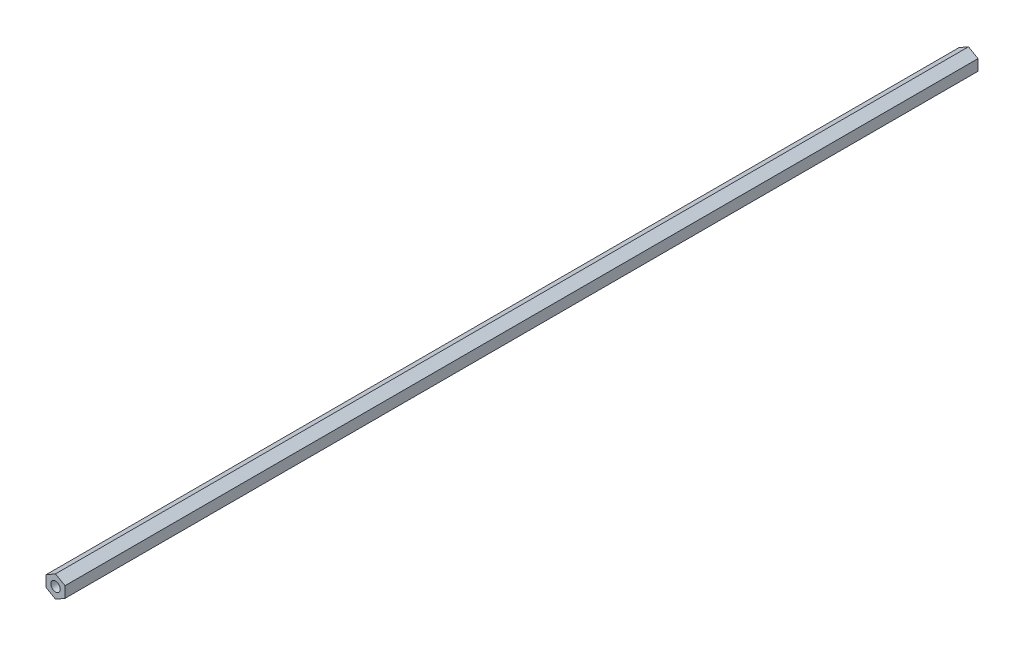
ISO-10303-21;
HEADER;
FILE_DESCRIPTION(('STEP AP214'),'2;1');
FILE_NAME('part.step','',(''),(''),'','','');
FILE_SCHEMA(('AUTOMOTIVE_DESIGN { 1 0 10303 214 1 1 1 1 }'));
ENDSEC;
DATA;
#1=APPLICATION_CONTEXT('core data for automotive mechanical design processes');
#2=APPLICATION_PROTOCOL_DEFINITION('international standard','automotive_design',2000,#1);
#3=PRODUCT_CONTEXT('',#1,'mechanical');
#4=PRODUCT('Part','Part','',(#3));
#5=PRODUCT_RELATED_PRODUCT_CATEGORY('part','',(#4));
#6=PRODUCT_DEFINITION_FORMATION('','',#4);
#7=PRODUCT_DEFINITION_CONTEXT('part definition',#1,'design');
#8=PRODUCT_DEFINITION('design','',#6,#7);
#9=PRODUCT_DEFINITION_SHAPE('','',#8);
#10=(LENGTH_UNIT() NAMED_UNIT(*) SI_UNIT(.MILLI.,.METRE.));
#11=(NAMED_UNIT(*) PLANE_ANGLE_UNIT() SI_UNIT($,.RADIAN.));
#12=(NAMED_UNIT(*) SI_UNIT($,.STERADIAN.) SOLID_ANGLE_UNIT());
#13=UNCERTAINTY_MEASURE_WITH_UNIT(LENGTH_MEASURE(1.E-05),#10,'distance_accuracy_value','');
#14=(GEOMETRIC_REPRESENTATION_CONTEXT(3) GLOBAL_UNCERTAINTY_ASSIGNED_CONTEXT((#13)) GLOBAL_UNIT_ASSIGNED_CONTEXT((#10,
#11,#12)) REPRESENTATION_CONTEXT('',''));
#15=CARTESIAN_POINT('',(0.,0.,0.));
#16=DIRECTION('',(0.,0.,1.));
#17=DIRECTION('',(1.,0.,0.));
#18=AXIS2_PLACEMENT_3D('',#15,#16,#17);
#19=CARTESIAN_POINT('',(-6.35,3.66617420935411,304.8));
#20=DIRECTION('',(1.,0.,0.));
#21=DIRECTION('',(0.,0.,-1.));
#22=AXIS2_PLACEMENT_3D('',#19,#20,#21);
#23=PLANE('',#22);
#24=DIRECTION('',(0.,0.,-1.));
#25=VECTOR('',#24,1.);
#26=CARTESIAN_POINT('',(-6.35,3.66617420935411,304.8));
#27=LINE('',#26,#25);
#28=CARTESIAN_POINT('',(-6.35,3.66617420935411,304.8));
#29=VERTEX_POINT('',#28);
#30=CARTESIAN_POINT('',(-6.35,3.66617420935411,-304.8));
#31=VERTEX_POINT('',#30);
#32=EDGE_CURVE('E141',#29,#31,#27,.T.);
#33=ORIENTED_EDGE('',*,*,#32,.T.);
#34=DIRECTION('',(0.,-1.,0.));
#35=VECTOR('',#34,1.);
#36=CARTESIAN_POINT('',(-6.35,3.66617420935411,-304.8));
#37=LINE('',#36,#35);
#38=CARTESIAN_POINT('',(-6.35,-3.66617420935413,-304.8));
#39=VERTEX_POINT('',#38);
#40=EDGE_CURVE('E113',#31,#39,#37,.T.);
#41=ORIENTED_EDGE('',*,*,#40,.T.);
#42=DIRECTION('',(0.,0.,-1.));
#43=VECTOR('',#42,1.);
#44=CARTESIAN_POINT('',(-6.35,-3.66617420935413,304.8));
#45=LINE('',#44,#43);
#46=CARTESIAN_POINT('',(-6.35,-3.66617420935413,304.8));
#47=VERTEX_POINT('',#46);
#48=EDGE_CURVE('E11',#47,#39,#45,.T.);
#49=ORIENTED_EDGE('',*,*,#48,.F.);
#50=DIRECTION('',(0.,-1.,0.));
#51=VECTOR('',#50,1.);
#52=CARTESIAN_POINT('',(-6.35,3.66617420935411,304.8));
#53=LINE('',#52,#51);
#54=EDGE_CURVE('E131',#29,#47,#53,.T.);
#55=ORIENTED_EDGE('',*,*,#54,.F.);
#56=EDGE_LOOP('',(#33,#41,#49,#55));
#57=FACE_BOUND('',#56,.T.);
#58=ADVANCED_FACE('F37',(#57),#23,.F.);
#59=CARTESIAN_POINT('',(-6.35,-3.66617420935413,304.8));
#60=DIRECTION('',(0.5,0.866025403784439,0.));
#61=DIRECTION('',(-0.866025403784438,0.5,0.));
#62=AXIS2_PLACEMENT_3D('',#59,#60,#61);
#63=PLANE('',#62);
#64=ORIENTED_EDGE('',*,*,#48,.T.);
#65=DIRECTION('',(0.866025403784439,-0.5,0.));
#66=VECTOR('',#65,1.);
#67=CARTESIAN_POINT('',(-6.35,-3.66617420935413,-304.8));
#68=LINE('',#67,#66);
#69=CARTESIAN_POINT('',(0.,-7.33234841870826,-304.8));
#70=VERTEX_POINT('',#69);
#71=EDGE_CURVE('E116',#39,#70,#68,.T.);
#72=ORIENTED_EDGE('',*,*,#71,.T.);
#73=DIRECTION('',(0.,0.,-1.));
#74=VECTOR('',#73,1.);
#75=CARTESIAN_POINT('',(0.,-7.33234841870826,304.8));
#76=LINE('',#75,#74);
#77=CARTESIAN_POINT('',(0.,-7.33234841870826,304.8));
#78=VERTEX_POINT('',#77);
#79=EDGE_CURVE('E44',#78,#70,#76,.T.);
#80=ORIENTED_EDGE('',*,*,#79,.F.);
#81=DIRECTION('',(0.866025403784439,-0.5,0.));
#82=VECTOR('',#81,1.);
#83=CARTESIAN_POINT('',(-6.35,-3.66617420935413,304.8));
#84=LINE('',#83,#82);
#85=EDGE_CURVE('E133',#47,#78,#84,.T.);
#86=ORIENTED_EDGE('',*,*,#85,.F.);
#87=EDGE_LOOP('',(#64,#72,#80,#86));
#88=FACE_BOUND('',#87,.T.);
#89=ADVANCED_FACE('F161',(#88),#63,.F.);
#90=CARTESIAN_POINT('',(0.,-7.33234841870826,304.8));
#91=DIRECTION('',(-0.5,0.866025403784439,0.));
#92=DIRECTION('',(-0.866025403784439,-0.5,0.));
#93=AXIS2_PLACEMENT_3D('',#90,#91,#92);
#94=PLANE('',#93);
#95=ORIENTED_EDGE('',*,*,#79,.T.);
#96=DIRECTION('',(0.866025403784439,0.5,0.));
#97=VECTOR('',#96,1.);
#98=CARTESIAN_POINT('',(0.,-7.33234841870826,-304.8));
#99=LINE('',#98,#97);
#100=CARTESIAN_POINT('',(6.35,-3.66617420935414,-304.8));
#101=VERTEX_POINT('',#100);
#102=EDGE_CURVE('E119',#70,#101,#99,.T.);
#103=ORIENTED_EDGE('',*,*,#102,.T.);
#104=DIRECTION('',(0.,0.,-1.));
#105=VECTOR('',#104,1.);
#106=CARTESIAN_POINT('',(6.35,-3.66617420935414,304.8));
#107=LINE('',#106,#105);
#108=CARTESIAN_POINT('',(6.35,-3.66617420935414,304.8));
#109=VERTEX_POINT('',#108);
#110=EDGE_CURVE('E147',#109,#101,#107,.T.);
#111=ORIENTED_EDGE('',*,*,#110,.F.);
#112=DIRECTION('',(0.866025403784439,0.5,0.));
#113=VECTOR('',#112,1.);
#114=CARTESIAN_POINT('',(0.,-7.33234841870826,304.8));
#115=LINE('',#114,#113);
#116=EDGE_CURVE('E135',#78,#109,#115,.T.);
#117=ORIENTED_EDGE('',*,*,#116,.F.);
#118=EDGE_LOOP('',(#95,#103,#111,#117));
#119=FACE_BOUND('',#118,.T.);
#120=ADVANCED_FACE('F152',(#119),#94,.F.);
#121=CARTESIAN_POINT('',(6.35,-3.66617420935414,304.8));
#122=DIRECTION('',(-1.,0.,0.));
#123=DIRECTION('',(0.,-1.,0.));
#124=AXIS2_PLACEMENT_3D('',#121,#122,#123);
#125=PLANE('',#124);
#126=ORIENTED_EDGE('',*,*,#110,.T.);
#127=DIRECTION('',(0.,1.,0.));
#128=VECTOR('',#127,1.);
#129=CARTESIAN_POINT('',(6.35,-3.66617420935414,-304.8));
#130=LINE('',#129,#128);
#131=CARTESIAN_POINT('',(6.35,3.66617420935412,-304.8));
#132=VERTEX_POINT('',#131);
#133=EDGE_CURVE('E122',#101,#132,#130,.T.);
#134=ORIENTED_EDGE('',*,*,#133,.T.);
#135=DIRECTION('',(0.,0.,-1.));
#136=VECTOR('',#135,1.);
#137=CARTESIAN_POINT('',(6.35,3.66617420935412,304.8));
#138=LINE('',#137,#136);
#139=CARTESIAN_POINT('',(6.35,3.66617420935412,304.8));
#140=VERTEX_POINT('',#139);
#141=EDGE_CURVE('E145',#140,#132,#138,.T.);
#142=ORIENTED_EDGE('',*,*,#141,.F.);
#143=DIRECTION('',(0.,1.,0.));
#144=VECTOR('',#143,1.);
#145=CARTESIAN_POINT('',(6.35,-3.66617420935414,304.8));
#146=LINE('',#145,#144);
#147=EDGE_CURVE('E137',#109,#140,#146,.T.);
#148=ORIENTED_EDGE('',*,*,#147,.F.);
#149=EDGE_LOOP('',(#126,#134,#142,#148));
#150=FACE_BOUND('',#149,.T.);
#151=ADVANCED_FACE('F172',(#150),#125,.F.);
#152=CARTESIAN_POINT('',(6.35,3.66617420935412,304.8));
#153=DIRECTION('',(-0.5,-0.866025403784439,0.));
#154=DIRECTION('',(0.866025403784439,-0.5,0.));
#155=AXIS2_PLACEMENT_3D('',#152,#153,#154);
#156=PLANE('',#155);
#157=ORIENTED_EDGE('',*,*,#141,.T.);
#158=DIRECTION('',(-0.866025403784439,0.5,0.));
#159=VECTOR('',#158,1.);
#160=CARTESIAN_POINT('',(6.35,3.66617420935412,-304.8));
#161=LINE('',#160,#159);
#162=CARTESIAN_POINT('',(0.,7.33234841870824,-304.8));
#163=VERTEX_POINT('',#162);
#164=EDGE_CURVE('E125',#132,#163,#161,.T.);
#165=ORIENTED_EDGE('',*,*,#164,.T.);
#166=DIRECTION('',(0.,0.,-1.));
#167=VECTOR('',#166,1.);
#168=CARTESIAN_POINT('',(0.,7.33234841870824,304.8));
#169=LINE('',#168,#167);
#170=CARTESIAN_POINT('',(0.,7.33234841870824,304.8));
#171=VERTEX_POINT('',#170);
#172=EDGE_CURVE('E143',#171,#163,#169,.T.);
#173=ORIENTED_EDGE('',*,*,#172,.F.);
#174=DIRECTION('',(-0.866025403784439,0.5,0.));
#175=VECTOR('',#174,1.);
#176=CARTESIAN_POINT('',(6.35,3.66617420935412,304.8));
#177=LINE('',#176,#175);
#178=EDGE_CURVE('E56',#140,#171,#177,.T.);
#179=ORIENTED_EDGE('',*,*,#178,.F.);
#180=EDGE_LOOP('',(#157,#165,#173,#179));
#181=FACE_BOUND('',#180,.T.);
#182=ADVANCED_FACE('F169',(#181),#156,.F.);
#183=CARTESIAN_POINT('',(0.,7.33234841870824,304.8));
#184=DIRECTION('',(0.5,-0.866025403784439,0.));
#185=DIRECTION('',(0.866025403784439,0.5,0.));
#186=AXIS2_PLACEMENT_3D('',#183,#184,#185);
#187=PLANE('',#186);
#188=ORIENTED_EDGE('',*,*,#172,.T.);
#189=DIRECTION('',(-0.866025403784439,-0.5,0.));
#190=VECTOR('',#189,1.);
#191=CARTESIAN_POINT('',(0.,7.33234841870824,-304.8));
#192=LINE('',#191,#190);
#193=EDGE_CURVE('E128',#163,#31,#192,.T.);
#194=ORIENTED_EDGE('',*,*,#193,.T.);
#195=ORIENTED_EDGE('',*,*,#32,.F.);
#196=DIRECTION('',(-0.866025403784439,-0.5,0.));
#197=VECTOR('',#196,1.);
#198=CARTESIAN_POINT('',(0.,7.33234841870824,304.8));
#199=LINE('',#198,#197);
#200=EDGE_CURVE('E51',#171,#29,#199,.T.);
#201=ORIENTED_EDGE('',*,*,#200,.F.);
#202=EDGE_LOOP('',(#188,#194,#195,#201));
#203=FACE_BOUND('',#202,.T.);
#204=ADVANCED_FACE('F167',(#203),#187,.F.);
#205=CARTESIAN_POINT('',(0.,0.,304.8));
#206=DIRECTION('',(0.,0.,1.));
#207=DIRECTION('',(1.,0.,0.));
#208=AXIS2_PLACEMENT_3D('',#205,#206,#207);
#209=PLANE('',#208);
#210=CARTESIAN_POINT('',(0.,0.,304.8));
#211=DIRECTION('',(0.,0.,1.));
#212=DIRECTION('',(1.,0.,0.));
#213=AXIS2_PLACEMENT_3D('',#210,#211,#212);
#214=CIRCLE('',#213,3.17499999999999);
#215=CARTESIAN_POINT('',(3.17499999999999,0.,304.8));
#216=VERTEX_POINT('',#215);
#217=EDGE_CURVE('E102',#216,#216,#214,.T.);
#218=ORIENTED_EDGE('',*,*,#217,.F.);
#219=EDGE_LOOP('',(#218));
#220=FACE_BOUND('',#219,.T.);
#221=ORIENTED_EDGE('',*,*,#54,.T.);
#222=ORIENTED_EDGE('',*,*,#85,.T.);
#223=ORIENTED_EDGE('',*,*,#116,.T.);
#224=ORIENTED_EDGE('',*,*,#147,.T.);
#225=ORIENTED_EDGE('',*,*,#178,.T.);
#226=ORIENTED_EDGE('',*,*,#200,.T.);
#227=EDGE_LOOP('',(#221,#222,#223,#224,#225,#226));
#228=FACE_BOUND('',#227,.T.);
#229=ADVANCED_FACE('F174',(#220,#228),#209,.T.);
#230=CARTESIAN_POINT('',(0.,0.,-304.8));
#231=DIRECTION('',(0.,0.,1.));
#232=DIRECTION('',(1.,0.,0.));
#233=AXIS2_PLACEMENT_3D('',#230,#231,#232);
#234=PLANE('',#233);
#235=CARTESIAN_POINT('',(0.,0.,-304.8));
#236=DIRECTION('',(0.,0.,-1.));
#237=DIRECTION('',(-1.,0.,0.));
#238=AXIS2_PLACEMENT_3D('',#235,#236,#237);
#239=CIRCLE('',#238,3.17499999999999);
#240=CARTESIAN_POINT('',(-3.17499999999999,0.,-304.8));
#241=VERTEX_POINT('',#240);
#242=EDGE_CURVE('E103',#241,#241,#239,.T.);
#243=ORIENTED_EDGE('',*,*,#242,.F.);
#244=EDGE_LOOP('',(#243));
#245=FACE_BOUND('',#244,.T.);
#246=ORIENTED_EDGE('',*,*,#40,.F.);
#247=ORIENTED_EDGE('',*,*,#193,.F.);
#248=ORIENTED_EDGE('',*,*,#164,.F.);
#249=ORIENTED_EDGE('',*,*,#133,.F.);
#250=ORIENTED_EDGE('',*,*,#102,.F.);
#251=ORIENTED_EDGE('',*,*,#71,.F.);
#252=EDGE_LOOP('',(#246,#247,#248,#249,#250,#251));
#253=FACE_BOUND('',#252,.T.);
#254=ADVANCED_FACE('F159',(#245,#253),#234,.F.);
#255=CARTESIAN_POINT('',(0.,0.,279.4));
#256=DIRECTION('',(0.,0.,1.));
#257=DIRECTION('',(1.,0.,0.));
#258=AXIS2_PLACEMENT_3D('',#255,#256,#257);
#259=CONICAL_SURFACE('',#258,3.17499999999995,1.02974425867665);
#260=CARTESIAN_POINT('',(0.,0.,277.492267534588));
#261=VERTEX_POINT('',#260);
#262=VERTEX_LOOP('',#261);
#263=FACE_BOUND('',#262,.T.);
#264=CARTESIAN_POINT('',(0.,0.,279.4));
#265=DIRECTION('',(0.,0.,1.));
#266=DIRECTION('',(1.,0.,0.));
#267=AXIS2_PLACEMENT_3D('',#264,#265,#266);
#268=CIRCLE('',#267,3.17499999999995);
#269=CARTESIAN_POINT('',(3.17499999999995,0.,279.4));
#270=VERTEX_POINT('',#269);
#271=EDGE_CURVE('E106',#270,#270,#268,.T.);
#272=ORIENTED_EDGE('',*,*,#271,.T.);
#273=EDGE_LOOP('',(#272));
#274=FACE_BOUND('',#273,.T.);
#275=ADVANCED_FACE('F182',(#263,#274),#259,.F.);
#276=CARTESIAN_POINT('',(0.,0.,304.8));
#277=DIRECTION('',(0.,0.,1.));
#278=DIRECTION('',(1.,0.,0.));
#279=AXIS2_PLACEMENT_3D('',#276,#277,#278);
#280=CYLINDRICAL_SURFACE('',#279,3.17499999999997);
#281=ORIENTED_EDGE('',*,*,#271,.F.);
#282=EDGE_LOOP('',(#281));
#283=FACE_BOUND('',#282,.T.);
#284=ORIENTED_EDGE('',*,*,#217,.T.);
#285=EDGE_LOOP('',(#284));
#286=FACE_BOUND('',#285,.T.);
#287=ADVANCED_FACE('F96',(#283,#286),#280,.F.);
#288=CARTESIAN_POINT('',(0.,0.,-279.4));
#289=DIRECTION('',(0.,0.,-1.));
#290=DIRECTION('',(-1.,0.,0.));
#291=AXIS2_PLACEMENT_3D('',#288,#289,#290);
#292=CONICAL_SURFACE('',#291,3.17499999999995,1.02974425867665);
#293=CARTESIAN_POINT('',(0.,0.,-277.492267534588));
#294=VERTEX_POINT('',#293);
#295=VERTEX_LOOP('',#294);
#296=FACE_BOUND('',#295,.T.);
#297=CARTESIAN_POINT('',(0.,0.,-279.4));
#298=DIRECTION('',(0.,0.,-1.));
#299=DIRECTION('',(-1.,0.,0.));
#300=AXIS2_PLACEMENT_3D('',#297,#298,#299);
#301=CIRCLE('',#300,3.17499999999995);
#302=CARTESIAN_POINT('',(-3.17499999999995,0.,-279.4));
#303=VERTEX_POINT('',#302);
#304=EDGE_CURVE('E100',#303,#303,#301,.T.);
#305=ORIENTED_EDGE('',*,*,#304,.T.);
#306=EDGE_LOOP('',(#305));
#307=FACE_BOUND('',#306,.T.);
#308=ADVANCED_FACE('F92',(#296,#307),#292,.F.);
#309=CARTESIAN_POINT('',(0.,0.,-304.8));
#310=DIRECTION('',(0.,0.,-1.));
#311=DIRECTION('',(-1.,0.,0.));
#312=AXIS2_PLACEMENT_3D('',#309,#310,#311);
#313=CYLINDRICAL_SURFACE('',#312,3.17499999999997);
#314=ORIENTED_EDGE('',*,*,#304,.F.);
#315=EDGE_LOOP('',(#314));
#316=FACE_BOUND('',#315,.T.);
#317=ORIENTED_EDGE('',*,*,#242,.T.);
#318=EDGE_LOOP('',(#317));
#319=FACE_BOUND('',#318,.T.);
#320=ADVANCED_FACE('F95',(#316,#319),#313,.F.);
#321=CLOSED_SHELL('',(#58,#89,#120,#151,#182,#204,#229,#254,#275,#287,#308,#320));
#322=MANIFOLD_SOLID_BREP('B2',#321);
#323=ADVANCED_BREP_SHAPE_REPRESENTATION('',(#18,#322),#14);
#324=SHAPE_DEFINITION_REPRESENTATION(#9,#323);
ENDSEC;
END-ISO-10303-21;
